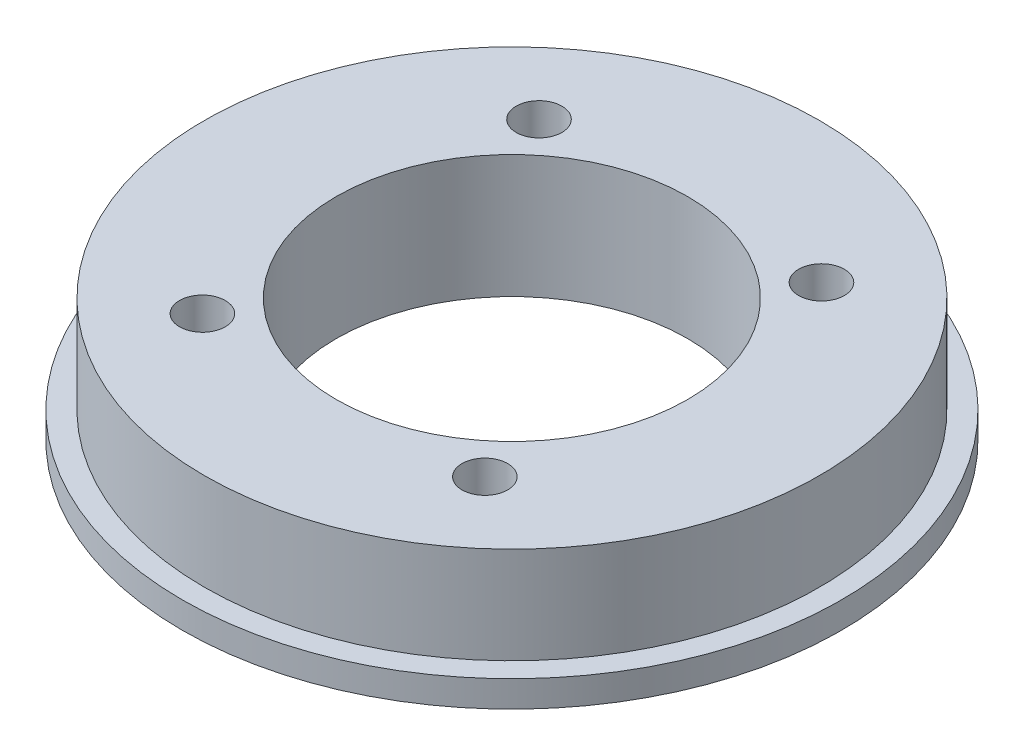
ISO-10303-21;
HEADER;
FILE_DESCRIPTION(('STEP AP214'),'2;1');
FILE_NAME('part.step','',(''),(''),'','','');
FILE_SCHEMA(('AUTOMOTIVE_DESIGN { 1 0 10303 214 1 1 1 1 }'));
ENDSEC;
DATA;
#1=APPLICATION_CONTEXT('core data for automotive mechanical design processes');
#2=APPLICATION_PROTOCOL_DEFINITION('international standard','automotive_design',2000,#1);
#3=PRODUCT_CONTEXT('',#1,'mechanical');
#4=PRODUCT('Part','Part','',(#3));
#5=PRODUCT_RELATED_PRODUCT_CATEGORY('part','',(#4));
#6=PRODUCT_DEFINITION_FORMATION('','',#4);
#7=PRODUCT_DEFINITION_CONTEXT('part definition',#1,'design');
#8=PRODUCT_DEFINITION('design','',#6,#7);
#9=PRODUCT_DEFINITION_SHAPE('','',#8);
#10=(LENGTH_UNIT() NAMED_UNIT(*) SI_UNIT(.MILLI.,.METRE.));
#11=(NAMED_UNIT(*) PLANE_ANGLE_UNIT() SI_UNIT($,.RADIAN.));
#12=(NAMED_UNIT(*) SI_UNIT($,.STERADIAN.) SOLID_ANGLE_UNIT());
#13=UNCERTAINTY_MEASURE_WITH_UNIT(LENGTH_MEASURE(1.E-05),#10,'distance_accuracy_value','');
#14=(GEOMETRIC_REPRESENTATION_CONTEXT(3) GLOBAL_UNCERTAINTY_ASSIGNED_CONTEXT((#13)) GLOBAL_UNIT_ASSIGNED_CONTEXT((#10,
#11,#12)) REPRESENTATION_CONTEXT('',''));
#15=CARTESIAN_POINT('',(0.,0.,0.));
#16=DIRECTION('',(0.,0.,1.));
#17=DIRECTION('',(1.,0.,0.));
#18=AXIS2_PLACEMENT_3D('',#15,#16,#17);
#19=CARTESIAN_POINT('',(-16.0696902421634,0.,19.1511110779745));
#20=DIRECTION('',(0.,1.,0.));
#21=DIRECTION('',(0.,0.,1.));
#22=AXIS2_PLACEMENT_3D('',#19,#20,#21);
#23=CYLINDRICAL_SURFACE('',#22,2.6);
#24=CARTESIAN_POINT('',(-16.0696902421634,14.,19.1511110779745));
#25=DIRECTION('',(0.,1.,0.));
#26=DIRECTION('',(0.,0.,1.));
#27=AXIS2_PLACEMENT_3D('',#24,#25,#26);
#28=CIRCLE('',#27,2.6);
#29=CARTESIAN_POINT('',(-16.0696902421634,14.,21.7511110779745));
#30=VERTEX_POINT('',#29);
#31=EDGE_CURVE('E89',#30,#30,#28,.T.);
#32=CARTESIAN_POINT('',(-16.0696902421634,3.,19.1511110779745));
#33=DIRECTION('',(0.,-1.,0.));
#34=DIRECTION('',(0.,0.,-1.));
#35=AXIS2_PLACEMENT_3D('',#32,#33,#34);
#36=CIRCLE('',#35,2.6);
#37=CARTESIAN_POINT('',(-16.0696902421634,3.,21.7511110779745));
#38=VERTEX_POINT('',#37);
#39=EDGE_CURVE('E37',#38,#38,#36,.F.);
#40=CARTESIAN_POINT('',(-16.0696902421634,14.,21.7511110779745));
#41=CARTESIAN_POINT('',(-16.0696902421634,13.8854166666667,21.7511110779745));
#42=CARTESIAN_POINT('',(-16.0696902421634,13.7708333333333,21.7511110779745));
#43=CARTESIAN_POINT('',(-16.0696902421634,13.5416666666667,21.7511110779745));
#44=CARTESIAN_POINT('',(-16.0696902421634,13.4270833333333,21.7511110779745));
#45=CARTESIAN_POINT('',(-16.0696902421634,13.1979166666667,21.7511110779745));
#46=CARTESIAN_POINT('',(-16.0696902421634,13.0833333333333,21.7511110779745));
#47=CARTESIAN_POINT('',(-16.0696902421634,12.8541666666667,21.7511110779745));
#48=CARTESIAN_POINT('',(-16.0696902421634,12.7395833333333,21.7511110779745));
#49=CARTESIAN_POINT('',(-16.0696902421634,12.5104166666667,21.7511110779745));
#50=CARTESIAN_POINT('',(-16.0696902421634,12.3958333333333,21.7511110779745));
#51=CARTESIAN_POINT('',(-16.0696902421634,12.1666666666667,21.7511110779745));
#52=CARTESIAN_POINT('',(-16.0696902421634,12.0520833333333,21.7511110779745));
#53=CARTESIAN_POINT('',(-16.0696902421634,11.8229166666667,21.7511110779745));
#54=CARTESIAN_POINT('',(-16.0696902421634,11.7083333333333,21.7511110779745));
#55=CARTESIAN_POINT('',(-16.0696902421634,11.4791666666667,21.7511110779745));
#56=CARTESIAN_POINT('',(-16.0696902421634,11.3645833333333,21.7511110779745));
#57=CARTESIAN_POINT('',(-16.0696902421634,11.1354166666667,21.7511110779745));
#58=CARTESIAN_POINT('',(-16.0696902421634,11.0208333333333,21.7511110779745));
#59=CARTESIAN_POINT('',(-16.0696902421634,10.7916666666667,21.7511110779745));
#60=CARTESIAN_POINT('',(-16.0696902421634,10.6770833333333,21.7511110779745));
#61=CARTESIAN_POINT('',(-16.0696902421634,10.4479166666667,21.7511110779745));
#62=CARTESIAN_POINT('',(-16.0696902421634,10.3333333333333,21.7511110779745));
#63=CARTESIAN_POINT('',(-16.0696902421634,10.1041666666667,21.7511110779745));
#64=CARTESIAN_POINT('',(-16.0696902421634,9.98958333333333,21.7511110779745));
#65=CARTESIAN_POINT('',(-16.0696902421634,9.76041666666666,21.7511110779745));
#66=CARTESIAN_POINT('',(-16.0696902421634,9.64583333333333,21.7511110779745));
#67=CARTESIAN_POINT('',(-16.0696902421634,9.41666666666667,21.7511110779745));
#68=CARTESIAN_POINT('',(-16.0696902421634,9.30208333333333,21.7511110779745));
#69=CARTESIAN_POINT('',(-16.0696902421634,9.07291666666666,21.7511110779745));
#70=CARTESIAN_POINT('',(-16.0696902421634,8.95833333333333,21.7511110779745));
#71=CARTESIAN_POINT('',(-16.0696902421634,8.72916666666667,21.7511110779745));
#72=CARTESIAN_POINT('',(-16.0696902421634,8.61458333333333,21.7511110779745));
#73=CARTESIAN_POINT('',(-16.0696902421634,8.38541666666667,21.7511110779745));
#74=CARTESIAN_POINT('',(-16.0696902421634,8.27083333333333,21.7511110779745));
#75=CARTESIAN_POINT('',(-16.0696902421634,8.04166666666667,21.7511110779745));
#76=CARTESIAN_POINT('',(-16.0696902421634,7.92708333333333,21.7511110779745));
#77=CARTESIAN_POINT('',(-16.0696902421634,7.69791666666667,21.7511110779745));
#78=CARTESIAN_POINT('',(-16.0696902421634,7.58333333333333,21.7511110779745));
#79=CARTESIAN_POINT('',(-16.0696902421634,7.35416666666667,21.7511110779745));
#80=CARTESIAN_POINT('',(-16.0696902421634,7.23958333333333,21.7511110779745));
#81=CARTESIAN_POINT('',(-16.0696902421634,7.01041666666667,21.7511110779745));
#82=CARTESIAN_POINT('',(-16.0696902421634,6.89583333333333,21.7511110779745));
#83=CARTESIAN_POINT('',(-16.0696902421634,6.66666666666667,21.7511110779745));
#84=CARTESIAN_POINT('',(-16.0696902421634,6.55208333333333,21.7511110779745));
#85=CARTESIAN_POINT('',(-16.0696902421634,6.32291666666667,21.7511110779745));
#86=CARTESIAN_POINT('',(-16.0696902421634,6.20833333333333,21.7511110779745));
#87=CARTESIAN_POINT('',(-16.0696902421634,5.97916666666667,21.7511110779745));
#88=CARTESIAN_POINT('',(-16.0696902421634,5.86458333333333,21.7511110779745));
#89=CARTESIAN_POINT('',(-16.0696902421634,5.63541666666667,21.7511110779745));
#90=CARTESIAN_POINT('',(-16.0696902421634,5.52083333333333,21.7511110779745));
#91=CARTESIAN_POINT('',(-16.0696902421634,5.29166666666667,21.7511110779745));
#92=CARTESIAN_POINT('',(-16.0696902421634,5.17708333333333,21.7511110779745));
#93=CARTESIAN_POINT('',(-16.0696902421634,4.94791666666667,21.7511110779745));
#94=CARTESIAN_POINT('',(-16.0696902421634,4.83333333333333,21.7511110779745));
#95=CARTESIAN_POINT('',(-16.0696902421634,4.60416666666667,21.7511110779745));
#96=CARTESIAN_POINT('',(-16.0696902421634,4.48958333333333,21.7511110779745));
#97=CARTESIAN_POINT('',(-16.0696902421634,4.26041666666667,21.7511110779745));
#98=CARTESIAN_POINT('',(-16.0696902421634,4.14583333333333,21.7511110779745));
#99=CARTESIAN_POINT('',(-16.0696902421634,3.91666666666667,21.7511110779745));
#100=CARTESIAN_POINT('',(-16.0696902421634,3.80208333333333,21.7511110779745));
#101=CARTESIAN_POINT('',(-16.0696902421634,3.57291666666667,21.7511110779745));
#102=CARTESIAN_POINT('',(-16.0696902421634,3.45833333333333,21.7511110779745));
#103=CARTESIAN_POINT('',(-16.0696902421634,3.22916666666667,21.7511110779745));
#104=CARTESIAN_POINT('',(-16.0696902421634,3.11458333333333,21.7511110779745));
#105=CARTESIAN_POINT('',(-16.0696902421634,3.,21.7511110779745));
#106=B_SPLINE_CURVE_WITH_KNOTS('',3,(#40,#41,#42,#43,#44,#45,#46,#47,#48,#49,#50,#51,#52,#53,
#54,#55,#56,#57,#58,#59,#60,#61,#62,#63,#64,#65,#66,#67,#68,#69,#70,#71,#72,#73,#74,#75,#76,#77,
#78,#79,#80,#81,#82,#83,#84,#85,#86,#87,#88,#89,#90,#91,#92,#93,#94,#95,#96,#97,#98,#99,#100,
#101,#102,#103,#104,#105),.UNSPECIFIED.,.F.,.F.,(4,2,2,2,2,2,2,2,2,2,2,2,2,2,2,2,2,2,2,2,2,2,2,
2,2,2,2,2,2,2,2,2,4),(0.,0.34375,0.687500000000001,1.03125,1.375,1.71875,2.0625,2.40625,2.75,
3.09375,3.4375,3.78125,4.125,4.46875,4.8125,5.15625,5.5,5.84375,6.1875,6.53125,6.875,7.21875,
7.5625,7.90625,8.25,8.59375,8.9375,9.28125,9.625,9.96875,10.3125,10.65625,11.),.UNSPECIFIED.);
#107=EDGE_CURVE('BSEAM33',#30,#38,#106,.T.);
#108=ORIENTED_EDGE('',*,*,#31,.T.);
#109=ORIENTED_EDGE('',*,*,#39,.F.);
#110=ORIENTED_EDGE('',*,*,#107,.T.);
#111=ORIENTED_EDGE('',*,*,#107,.F.);
#112=EDGE_LOOP('',(#108,#110,#109,#111));
#113=FACE_BOUND('',#112,.T.);
#114=ADVANCED_FACE('F33',(#113),#23,.F.);
#115=CARTESIAN_POINT('',(16.0696902421634,0.,19.1511110779745));
#116=DIRECTION('',(0.,1.,0.));
#117=DIRECTION('',(0.,0.,1.));
#118=AXIS2_PLACEMENT_3D('',#115,#116,#117);
#119=CYLINDRICAL_SURFACE('',#118,2.6);
#120=CARTESIAN_POINT('',(16.0696902421634,14.,19.1511110779745));
#121=DIRECTION('',(0.,1.,0.));
#122=DIRECTION('',(0.,0.,1.));
#123=AXIS2_PLACEMENT_3D('',#120,#121,#122);
#124=CIRCLE('',#123,2.6);
#125=CARTESIAN_POINT('',(16.0696902421634,14.,21.7511110779745));
#126=VERTEX_POINT('',#125);
#127=EDGE_CURVE('E94',#126,#126,#124,.T.);
#128=CARTESIAN_POINT('',(16.0696902421634,3.,19.1511110779745));
#129=DIRECTION('',(0.,-1.,0.));
#130=DIRECTION('',(0.,0.,-1.));
#131=AXIS2_PLACEMENT_3D('',#128,#129,#130);
#132=CIRCLE('',#131,2.6);
#133=CARTESIAN_POINT('',(16.0696902421634,3.,21.7511110779745));
#134=VERTEX_POINT('',#133);
#135=EDGE_CURVE('E61',#134,#134,#132,.F.);
#136=CARTESIAN_POINT('',(16.0696902421634,14.,21.7511110779745));
#137=CARTESIAN_POINT('',(16.0696902421634,13.8854166666667,21.7511110779745));
#138=CARTESIAN_POINT('',(16.0696902421634,13.7708333333333,21.7511110779745));
#139=CARTESIAN_POINT('',(16.0696902421634,13.5416666666667,21.7511110779745));
#140=CARTESIAN_POINT('',(16.0696902421634,13.4270833333333,21.7511110779745));
#141=CARTESIAN_POINT('',(16.0696902421634,13.1979166666667,21.7511110779745));
#142=CARTESIAN_POINT('',(16.0696902421634,13.0833333333333,21.7511110779745));
#143=CARTESIAN_POINT('',(16.0696902421634,12.8541666666667,21.7511110779745));
#144=CARTESIAN_POINT('',(16.0696902421634,12.7395833333333,21.7511110779745));
#145=CARTESIAN_POINT('',(16.0696902421634,12.5104166666667,21.7511110779745));
#146=CARTESIAN_POINT('',(16.0696902421634,12.3958333333333,21.7511110779745));
#147=CARTESIAN_POINT('',(16.0696902421634,12.1666666666667,21.7511110779745));
#148=CARTESIAN_POINT('',(16.0696902421634,12.0520833333333,21.7511110779745));
#149=CARTESIAN_POINT('',(16.0696902421634,11.8229166666667,21.7511110779745));
#150=CARTESIAN_POINT('',(16.0696902421634,11.7083333333333,21.7511110779745));
#151=CARTESIAN_POINT('',(16.0696902421634,11.4791666666667,21.7511110779745));
#152=CARTESIAN_POINT('',(16.0696902421634,11.3645833333333,21.7511110779745));
#153=CARTESIAN_POINT('',(16.0696902421634,11.1354166666667,21.7511110779745));
#154=CARTESIAN_POINT('',(16.0696902421634,11.0208333333333,21.7511110779745));
#155=CARTESIAN_POINT('',(16.0696902421634,10.7916666666667,21.7511110779745));
#156=CARTESIAN_POINT('',(16.0696902421634,10.6770833333333,21.7511110779745));
#157=CARTESIAN_POINT('',(16.0696902421634,10.4479166666667,21.7511110779745));
#158=CARTESIAN_POINT('',(16.0696902421634,10.3333333333333,21.7511110779745));
#159=CARTESIAN_POINT('',(16.0696902421634,10.1041666666667,21.7511110779745));
#160=CARTESIAN_POINT('',(16.0696902421634,9.98958333333333,21.7511110779745));
#161=CARTESIAN_POINT('',(16.0696902421634,9.76041666666666,21.7511110779745));
#162=CARTESIAN_POINT('',(16.0696902421634,9.64583333333333,21.7511110779745));
#163=CARTESIAN_POINT('',(16.0696902421634,9.41666666666667,21.7511110779745));
#164=CARTESIAN_POINT('',(16.0696902421634,9.30208333333333,21.7511110779745));
#165=CARTESIAN_POINT('',(16.0696902421634,9.07291666666666,21.7511110779745));
#166=CARTESIAN_POINT('',(16.0696902421634,8.95833333333333,21.7511110779745));
#167=CARTESIAN_POINT('',(16.0696902421634,8.72916666666667,21.7511110779745));
#168=CARTESIAN_POINT('',(16.0696902421634,8.61458333333333,21.7511110779745));
#169=CARTESIAN_POINT('',(16.0696902421634,8.38541666666667,21.7511110779745));
#170=CARTESIAN_POINT('',(16.0696902421634,8.27083333333333,21.7511110779745));
#171=CARTESIAN_POINT('',(16.0696902421634,8.04166666666667,21.7511110779745));
#172=CARTESIAN_POINT('',(16.0696902421634,7.92708333333333,21.7511110779745));
#173=CARTESIAN_POINT('',(16.0696902421634,7.69791666666667,21.7511110779745));
#174=CARTESIAN_POINT('',(16.0696902421634,7.58333333333333,21.7511110779745));
#175=CARTESIAN_POINT('',(16.0696902421634,7.35416666666667,21.7511110779745));
#176=CARTESIAN_POINT('',(16.0696902421634,7.23958333333333,21.7511110779745));
#177=CARTESIAN_POINT('',(16.0696902421634,7.01041666666667,21.7511110779745));
#178=CARTESIAN_POINT('',(16.0696902421634,6.89583333333333,21.7511110779745));
#179=CARTESIAN_POINT('',(16.0696902421634,6.66666666666667,21.7511110779745));
#180=CARTESIAN_POINT('',(16.0696902421634,6.55208333333333,21.7511110779745));
#181=CARTESIAN_POINT('',(16.0696902421634,6.32291666666667,21.7511110779745));
#182=CARTESIAN_POINT('',(16.0696902421634,6.20833333333333,21.7511110779745));
#183=CARTESIAN_POINT('',(16.0696902421634,5.97916666666667,21.7511110779745));
#184=CARTESIAN_POINT('',(16.0696902421634,5.86458333333333,21.7511110779745));
#185=CARTESIAN_POINT('',(16.0696902421634,5.63541666666667,21.7511110779745));
#186=CARTESIAN_POINT('',(16.0696902421634,5.52083333333333,21.7511110779745));
#187=CARTESIAN_POINT('',(16.0696902421634,5.29166666666667,21.7511110779745));
#188=CARTESIAN_POINT('',(16.0696902421634,5.17708333333333,21.7511110779745));
#189=CARTESIAN_POINT('',(16.0696902421634,4.94791666666667,21.7511110779745));
#190=CARTESIAN_POINT('',(16.0696902421634,4.83333333333333,21.7511110779745));
#191=CARTESIAN_POINT('',(16.0696902421634,4.60416666666667,21.7511110779745));
#192=CARTESIAN_POINT('',(16.0696902421634,4.48958333333333,21.7511110779745));
#193=CARTESIAN_POINT('',(16.0696902421634,4.26041666666667,21.7511110779745));
#194=CARTESIAN_POINT('',(16.0696902421634,4.14583333333333,21.7511110779745));
#195=CARTESIAN_POINT('',(16.0696902421634,3.91666666666667,21.7511110779745));
#196=CARTESIAN_POINT('',(16.0696902421634,3.80208333333333,21.7511110779745));
#197=CARTESIAN_POINT('',(16.0696902421634,3.57291666666667,21.7511110779745));
#198=CARTESIAN_POINT('',(16.0696902421634,3.45833333333333,21.7511110779745));
#199=CARTESIAN_POINT('',(16.0696902421634,3.22916666666667,21.7511110779745));
#200=CARTESIAN_POINT('',(16.0696902421634,3.11458333333333,21.7511110779745));
#201=CARTESIAN_POINT('',(16.0696902421634,3.,21.7511110779745));
#202=B_SPLINE_CURVE_WITH_KNOTS('',3,(#136,#137,#138,#139,#140,#141,#142,#143,#144,#145,#146,
#147,#148,#149,#150,#151,#152,#153,#154,#155,#156,#157,#158,#159,#160,#161,#162,#163,#164,#165,
#166,#167,#168,#169,#170,#171,#172,#173,#174,#175,#176,#177,#178,#179,#180,#181,#182,#183,#184,
#185,#186,#187,#188,#189,#190,#191,#192,#193,#194,#195,#196,#197,#198,#199,#200,#201),
.UNSPECIFIED.,.F.,.F.,(4,2,2,2,2,2,2,2,2,2,2,2,2,2,2,2,2,2,2,2,2,2,2,2,2,2,2,2,2,2,2,2,4),(0.,
0.34375,0.687500000000001,1.03125,1.375,1.71875,2.0625,2.40625,2.75,3.09375,3.4375,3.78125,
4.125,4.46875,4.8125,5.15625,5.5,5.84375,6.1875,6.53125,6.875,7.21875,7.5625,7.90625,8.25,
8.59375,8.9375,9.28125,9.625,9.96875,10.3125,10.65625,11.),.UNSPECIFIED.);
#203=EDGE_CURVE('BSEAM125',#126,#134,#202,.T.);
#204=ORIENTED_EDGE('',*,*,#127,.T.);
#205=ORIENTED_EDGE('',*,*,#135,.F.);
#206=ORIENTED_EDGE('',*,*,#203,.T.);
#207=ORIENTED_EDGE('',*,*,#203,.F.);
#208=EDGE_LOOP('',(#204,#206,#205,#207));
#209=FACE_BOUND('',#208,.T.);
#210=ADVANCED_FACE('F125',(#209),#119,.F.);
#211=CARTESIAN_POINT('',(-16.0696902421634,0.,-19.1511110779745));
#212=DIRECTION('',(0.,1.,0.));
#213=DIRECTION('',(0.,0.,1.));
#214=AXIS2_PLACEMENT_3D('',#211,#212,#213);
#215=CYLINDRICAL_SURFACE('',#214,2.6);
#216=CARTESIAN_POINT('',(-16.0696902421634,14.,-19.1511110779745));
#217=DIRECTION('',(0.,1.,0.));
#218=DIRECTION('',(0.,0.,1.));
#219=AXIS2_PLACEMENT_3D('',#216,#217,#218);
#220=CIRCLE('',#219,2.6);
#221=CARTESIAN_POINT('',(-16.0696902421634,14.,-16.5511110779745));
#222=VERTEX_POINT('',#221);
#223=EDGE_CURVE('E100',#222,#222,#220,.T.);
#224=CARTESIAN_POINT('',(-16.0696902421634,3.,-19.1511110779745));
#225=DIRECTION('',(0.,-1.,0.));
#226=DIRECTION('',(0.,0.,-1.));
#227=AXIS2_PLACEMENT_3D('',#224,#225,#226);
#228=CIRCLE('',#227,2.6);
#229=CARTESIAN_POINT('',(-16.0696902421634,3.,-16.5511110779745));
#230=VERTEX_POINT('',#229);
#231=EDGE_CURVE('E57',#230,#230,#228,.F.);
#232=CARTESIAN_POINT('',(-16.0696902421634,14.,-16.5511110779745));
#233=CARTESIAN_POINT('',(-16.0696902421634,13.8854166666667,-16.5511110779745));
#234=CARTESIAN_POINT('',(-16.0696902421634,13.7708333333333,-16.5511110779745));
#235=CARTESIAN_POINT('',(-16.0696902421634,13.5416666666667,-16.5511110779745));
#236=CARTESIAN_POINT('',(-16.0696902421634,13.4270833333333,-16.5511110779745));
#237=CARTESIAN_POINT('',(-16.0696902421634,13.1979166666667,-16.5511110779745));
#238=CARTESIAN_POINT('',(-16.0696902421634,13.0833333333333,-16.5511110779745));
#239=CARTESIAN_POINT('',(-16.0696902421634,12.8541666666667,-16.5511110779745));
#240=CARTESIAN_POINT('',(-16.0696902421634,12.7395833333333,-16.5511110779745));
#241=CARTESIAN_POINT('',(-16.0696902421634,12.5104166666667,-16.5511110779745));
#242=CARTESIAN_POINT('',(-16.0696902421634,12.3958333333333,-16.5511110779745));
#243=CARTESIAN_POINT('',(-16.0696902421634,12.1666666666667,-16.5511110779745));
#244=CARTESIAN_POINT('',(-16.0696902421634,12.0520833333333,-16.5511110779745));
#245=CARTESIAN_POINT('',(-16.0696902421634,11.8229166666667,-16.5511110779745));
#246=CARTESIAN_POINT('',(-16.0696902421634,11.7083333333333,-16.5511110779745));
#247=CARTESIAN_POINT('',(-16.0696902421634,11.4791666666667,-16.5511110779745));
#248=CARTESIAN_POINT('',(-16.0696902421634,11.3645833333333,-16.5511110779745));
#249=CARTESIAN_POINT('',(-16.0696902421634,11.1354166666667,-16.5511110779745));
#250=CARTESIAN_POINT('',(-16.0696902421634,11.0208333333333,-16.5511110779745));
#251=CARTESIAN_POINT('',(-16.0696902421634,10.7916666666667,-16.5511110779745));
#252=CARTESIAN_POINT('',(-16.0696902421634,10.6770833333333,-16.5511110779745));
#253=CARTESIAN_POINT('',(-16.0696902421634,10.4479166666667,-16.5511110779745));
#254=CARTESIAN_POINT('',(-16.0696902421634,10.3333333333333,-16.5511110779745));
#255=CARTESIAN_POINT('',(-16.0696902421634,10.1041666666667,-16.5511110779745));
#256=CARTESIAN_POINT('',(-16.0696902421634,9.98958333333333,-16.5511110779745));
#257=CARTESIAN_POINT('',(-16.0696902421634,9.76041666666666,-16.5511110779745));
#258=CARTESIAN_POINT('',(-16.0696902421634,9.64583333333333,-16.5511110779745));
#259=CARTESIAN_POINT('',(-16.0696902421634,9.41666666666667,-16.5511110779745));
#260=CARTESIAN_POINT('',(-16.0696902421634,9.30208333333333,-16.5511110779745));
#261=CARTESIAN_POINT('',(-16.0696902421634,9.07291666666666,-16.5511110779745));
#262=CARTESIAN_POINT('',(-16.0696902421634,8.95833333333333,-16.5511110779745));
#263=CARTESIAN_POINT('',(-16.0696902421634,8.72916666666667,-16.5511110779745));
#264=CARTESIAN_POINT('',(-16.0696902421634,8.61458333333333,-16.5511110779745));
#265=CARTESIAN_POINT('',(-16.0696902421634,8.38541666666667,-16.5511110779745));
#266=CARTESIAN_POINT('',(-16.0696902421634,8.27083333333333,-16.5511110779745));
#267=CARTESIAN_POINT('',(-16.0696902421634,8.04166666666667,-16.5511110779745));
#268=CARTESIAN_POINT('',(-16.0696902421634,7.92708333333333,-16.5511110779745));
#269=CARTESIAN_POINT('',(-16.0696902421634,7.69791666666667,-16.5511110779745));
#270=CARTESIAN_POINT('',(-16.0696902421634,7.58333333333333,-16.5511110779745));
#271=CARTESIAN_POINT('',(-16.0696902421634,7.35416666666667,-16.5511110779745));
#272=CARTESIAN_POINT('',(-16.0696902421634,7.23958333333333,-16.5511110779745));
#273=CARTESIAN_POINT('',(-16.0696902421634,7.01041666666667,-16.5511110779745));
#274=CARTESIAN_POINT('',(-16.0696902421634,6.89583333333333,-16.5511110779745));
#275=CARTESIAN_POINT('',(-16.0696902421634,6.66666666666667,-16.5511110779745));
#276=CARTESIAN_POINT('',(-16.0696902421634,6.55208333333333,-16.5511110779745));
#277=CARTESIAN_POINT('',(-16.0696902421634,6.32291666666667,-16.5511110779745));
#278=CARTESIAN_POINT('',(-16.0696902421634,6.20833333333333,-16.5511110779745));
#279=CARTESIAN_POINT('',(-16.0696902421634,5.97916666666667,-16.5511110779745));
#280=CARTESIAN_POINT('',(-16.0696902421634,5.86458333333333,-16.5511110779745));
#281=CARTESIAN_POINT('',(-16.0696902421634,5.63541666666667,-16.5511110779745));
#282=CARTESIAN_POINT('',(-16.0696902421634,5.52083333333333,-16.5511110779745));
#283=CARTESIAN_POINT('',(-16.0696902421634,5.29166666666667,-16.5511110779745));
#284=CARTESIAN_POINT('',(-16.0696902421634,5.17708333333333,-16.5511110779745));
#285=CARTESIAN_POINT('',(-16.0696902421634,4.94791666666667,-16.5511110779745));
#286=CARTESIAN_POINT('',(-16.0696902421634,4.83333333333333,-16.5511110779745));
#287=CARTESIAN_POINT('',(-16.0696902421634,4.60416666666667,-16.5511110779745));
#288=CARTESIAN_POINT('',(-16.0696902421634,4.48958333333333,-16.5511110779745));
#289=CARTESIAN_POINT('',(-16.0696902421634,4.26041666666667,-16.5511110779745));
#290=CARTESIAN_POINT('',(-16.0696902421634,4.14583333333333,-16.5511110779745));
#291=CARTESIAN_POINT('',(-16.0696902421634,3.91666666666667,-16.5511110779745));
#292=CARTESIAN_POINT('',(-16.0696902421634,3.80208333333333,-16.5511110779745));
#293=CARTESIAN_POINT('',(-16.0696902421634,3.57291666666667,-16.5511110779745));
#294=CARTESIAN_POINT('',(-16.0696902421634,3.45833333333333,-16.5511110779745));
#295=CARTESIAN_POINT('',(-16.0696902421634,3.22916666666667,-16.5511110779745));
#296=CARTESIAN_POINT('',(-16.0696902421634,3.11458333333333,-16.5511110779745));
#297=CARTESIAN_POINT('',(-16.0696902421634,3.,-16.5511110779745));
#298=B_SPLINE_CURVE_WITH_KNOTS('',3,(#232,#233,#234,#235,#236,#237,#238,#239,#240,#241,#242,
#243,#244,#245,#246,#247,#248,#249,#250,#251,#252,#253,#254,#255,#256,#257,#258,#259,#260,#261,
#262,#263,#264,#265,#266,#267,#268,#269,#270,#271,#272,#273,#274,#275,#276,#277,#278,#279,#280,
#281,#282,#283,#284,#285,#286,#287,#288,#289,#290,#291,#292,#293,#294,#295,#296,#297),
.UNSPECIFIED.,.F.,.F.,(4,2,2,2,2,2,2,2,2,2,2,2,2,2,2,2,2,2,2,2,2,2,2,2,2,2,2,2,2,2,2,2,4),(0.,
0.34375,0.687500000000001,1.03125,1.375,1.71875,2.0625,2.40625,2.75,3.09375,3.4375,3.78125,
4.125,4.46875,4.8125,5.15625,5.5,5.84375,6.1875,6.53125,6.875,7.21875,7.5625,7.90625,8.25,
8.59375,8.9375,9.28125,9.625,9.96875,10.3125,10.65625,11.),.UNSPECIFIED.);
#299=EDGE_CURVE('BSEAM120',#222,#230,#298,.T.);
#300=ORIENTED_EDGE('',*,*,#223,.T.);
#301=ORIENTED_EDGE('',*,*,#231,.F.);
#302=ORIENTED_EDGE('',*,*,#299,.T.);
#303=ORIENTED_EDGE('',*,*,#299,.F.);
#304=EDGE_LOOP('',(#300,#302,#301,#303));
#305=FACE_BOUND('',#304,.T.);
#306=ADVANCED_FACE('F120',(#305),#215,.F.);
#307=CARTESIAN_POINT('',(16.0696902421634,0.,-19.1511110779745));
#308=DIRECTION('',(0.,1.,0.));
#309=DIRECTION('',(0.,0.,1.));
#310=AXIS2_PLACEMENT_3D('',#307,#308,#309);
#311=CYLINDRICAL_SURFACE('',#310,2.6);
#312=CARTESIAN_POINT('',(16.0696902421634,14.,-19.1511110779745));
#313=DIRECTION('',(0.,1.,0.));
#314=DIRECTION('',(0.,0.,1.));
#315=AXIS2_PLACEMENT_3D('',#312,#313,#314);
#316=CIRCLE('',#315,2.6);
#317=CARTESIAN_POINT('',(16.0696902421634,14.,-16.5511110779745));
#318=VERTEX_POINT('',#317);
#319=EDGE_CURVE('E97',#318,#318,#316,.T.);
#320=CARTESIAN_POINT('',(16.0696902421634,3.,-19.1511110779745));
#321=DIRECTION('',(0.,-1.,0.));
#322=DIRECTION('',(0.,0.,-1.));
#323=AXIS2_PLACEMENT_3D('',#320,#321,#322);
#324=CIRCLE('',#323,2.6);
#325=CARTESIAN_POINT('',(16.0696902421634,3.,-16.5511110779745));
#326=VERTEX_POINT('',#325);
#327=EDGE_CURVE('E52',#326,#326,#324,.F.);
#328=CARTESIAN_POINT('',(16.0696902421634,14.,-16.5511110779745));
#329=CARTESIAN_POINT('',(16.0696902421634,13.8854166666667,-16.5511110779745));
#330=CARTESIAN_POINT('',(16.0696902421634,13.7708333333333,-16.5511110779745));
#331=CARTESIAN_POINT('',(16.0696902421634,13.5416666666667,-16.5511110779745));
#332=CARTESIAN_POINT('',(16.0696902421634,13.4270833333333,-16.5511110779745));
#333=CARTESIAN_POINT('',(16.0696902421634,13.1979166666667,-16.5511110779745));
#334=CARTESIAN_POINT('',(16.0696902421634,13.0833333333333,-16.5511110779745));
#335=CARTESIAN_POINT('',(16.0696902421634,12.8541666666667,-16.5511110779745));
#336=CARTESIAN_POINT('',(16.0696902421634,12.7395833333333,-16.5511110779745));
#337=CARTESIAN_POINT('',(16.0696902421634,12.5104166666667,-16.5511110779745));
#338=CARTESIAN_POINT('',(16.0696902421634,12.3958333333333,-16.5511110779745));
#339=CARTESIAN_POINT('',(16.0696902421634,12.1666666666667,-16.5511110779745));
#340=CARTESIAN_POINT('',(16.0696902421634,12.0520833333333,-16.5511110779745));
#341=CARTESIAN_POINT('',(16.0696902421634,11.8229166666667,-16.5511110779745));
#342=CARTESIAN_POINT('',(16.0696902421634,11.7083333333333,-16.5511110779745));
#343=CARTESIAN_POINT('',(16.0696902421634,11.4791666666667,-16.5511110779745));
#344=CARTESIAN_POINT('',(16.0696902421634,11.3645833333333,-16.5511110779745));
#345=CARTESIAN_POINT('',(16.0696902421634,11.1354166666667,-16.5511110779745));
#346=CARTESIAN_POINT('',(16.0696902421634,11.0208333333333,-16.5511110779745));
#347=CARTESIAN_POINT('',(16.0696902421634,10.7916666666667,-16.5511110779745));
#348=CARTESIAN_POINT('',(16.0696902421634,10.6770833333333,-16.5511110779745));
#349=CARTESIAN_POINT('',(16.0696902421634,10.4479166666667,-16.5511110779745));
#350=CARTESIAN_POINT('',(16.0696902421634,10.3333333333333,-16.5511110779745));
#351=CARTESIAN_POINT('',(16.0696902421634,10.1041666666667,-16.5511110779745));
#352=CARTESIAN_POINT('',(16.0696902421634,9.98958333333333,-16.5511110779745));
#353=CARTESIAN_POINT('',(16.0696902421634,9.76041666666666,-16.5511110779745));
#354=CARTESIAN_POINT('',(16.0696902421634,9.64583333333333,-16.5511110779745));
#355=CARTESIAN_POINT('',(16.0696902421634,9.41666666666667,-16.5511110779745));
#356=CARTESIAN_POINT('',(16.0696902421634,9.30208333333333,-16.5511110779745));
#357=CARTESIAN_POINT('',(16.0696902421634,9.07291666666666,-16.5511110779745));
#358=CARTESIAN_POINT('',(16.0696902421634,8.95833333333333,-16.5511110779745));
#359=CARTESIAN_POINT('',(16.0696902421634,8.72916666666667,-16.5511110779745));
#360=CARTESIAN_POINT('',(16.0696902421634,8.61458333333333,-16.5511110779745));
#361=CARTESIAN_POINT('',(16.0696902421634,8.38541666666667,-16.5511110779745));
#362=CARTESIAN_POINT('',(16.0696902421634,8.27083333333333,-16.5511110779745));
#363=CARTESIAN_POINT('',(16.0696902421634,8.04166666666667,-16.5511110779745));
#364=CARTESIAN_POINT('',(16.0696902421634,7.92708333333333,-16.5511110779745));
#365=CARTESIAN_POINT('',(16.0696902421634,7.69791666666667,-16.5511110779745));
#366=CARTESIAN_POINT('',(16.0696902421634,7.58333333333333,-16.5511110779745));
#367=CARTESIAN_POINT('',(16.0696902421634,7.35416666666667,-16.5511110779745));
#368=CARTESIAN_POINT('',(16.0696902421634,7.23958333333333,-16.5511110779745));
#369=CARTESIAN_POINT('',(16.0696902421634,7.01041666666667,-16.5511110779745));
#370=CARTESIAN_POINT('',(16.0696902421634,6.89583333333333,-16.5511110779745));
#371=CARTESIAN_POINT('',(16.0696902421634,6.66666666666667,-16.5511110779745));
#372=CARTESIAN_POINT('',(16.0696902421634,6.55208333333333,-16.5511110779745));
#373=CARTESIAN_POINT('',(16.0696902421634,6.32291666666667,-16.5511110779745));
#374=CARTESIAN_POINT('',(16.0696902421634,6.20833333333333,-16.5511110779745));
#375=CARTESIAN_POINT('',(16.0696902421634,5.97916666666667,-16.5511110779745));
#376=CARTESIAN_POINT('',(16.0696902421634,5.86458333333333,-16.5511110779745));
#377=CARTESIAN_POINT('',(16.0696902421634,5.63541666666667,-16.5511110779745));
#378=CARTESIAN_POINT('',(16.0696902421634,5.52083333333333,-16.5511110779745));
#379=CARTESIAN_POINT('',(16.0696902421634,5.29166666666667,-16.5511110779745));
#380=CARTESIAN_POINT('',(16.0696902421634,5.17708333333333,-16.5511110779745));
#381=CARTESIAN_POINT('',(16.0696902421634,4.94791666666667,-16.5511110779745));
#382=CARTESIAN_POINT('',(16.0696902421634,4.83333333333333,-16.5511110779745));
#383=CARTESIAN_POINT('',(16.0696902421634,4.60416666666667,-16.5511110779745));
#384=CARTESIAN_POINT('',(16.0696902421634,4.48958333333333,-16.5511110779745));
#385=CARTESIAN_POINT('',(16.0696902421634,4.26041666666667,-16.5511110779745));
#386=CARTESIAN_POINT('',(16.0696902421634,4.14583333333333,-16.5511110779745));
#387=CARTESIAN_POINT('',(16.0696902421634,3.91666666666667,-16.5511110779745));
#388=CARTESIAN_POINT('',(16.0696902421634,3.80208333333333,-16.5511110779745));
#389=CARTESIAN_POINT('',(16.0696902421634,3.57291666666667,-16.5511110779745));
#390=CARTESIAN_POINT('',(16.0696902421634,3.45833333333333,-16.5511110779745));
#391=CARTESIAN_POINT('',(16.0696902421634,3.22916666666667,-16.5511110779745));
#392=CARTESIAN_POINT('',(16.0696902421634,3.11458333333333,-16.5511110779745));
#393=CARTESIAN_POINT('',(16.0696902421634,3.,-16.5511110779745));
#394=B_SPLINE_CURVE_WITH_KNOTS('',3,(#328,#329,#330,#331,#332,#333,#334,#335,#336,#337,#338,
#339,#340,#341,#342,#343,#344,#345,#346,#347,#348,#349,#350,#351,#352,#353,#354,#355,#356,#357,
#358,#359,#360,#361,#362,#363,#364,#365,#366,#367,#368,#369,#370,#371,#372,#373,#374,#375,#376,
#377,#378,#379,#380,#381,#382,#383,#384,#385,#386,#387,#388,#389,#390,#391,#392,#393),
.UNSPECIFIED.,.F.,.F.,(4,2,2,2,2,2,2,2,2,2,2,2,2,2,2,2,2,2,2,2,2,2,2,2,2,2,2,2,2,2,2,2,4),(0.,
0.34375,0.687500000000001,1.03125,1.375,1.71875,2.0625,2.40625,2.75,3.09375,3.4375,3.78125,
4.125,4.46875,4.8125,5.15625,5.5,5.84375,6.1875,6.53125,6.875,7.21875,7.5625,7.90625,8.25,
8.59375,8.9375,9.28125,9.625,9.96875,10.3125,10.65625,11.),.UNSPECIFIED.);
#395=EDGE_CURVE('BSEAM112',#318,#326,#394,.T.);
#396=ORIENTED_EDGE('',*,*,#319,.T.);
#397=ORIENTED_EDGE('',*,*,#327,.F.);
#398=ORIENTED_EDGE('',*,*,#395,.T.);
#399=ORIENTED_EDGE('',*,*,#395,.F.);
#400=EDGE_LOOP('',(#396,#398,#397,#399));
#401=FACE_BOUND('',#400,.T.);
#402=ADVANCED_FACE('F112',(#401),#311,.F.);
#403=CARTESIAN_POINT('',(0.,3.,0.));
#404=DIRECTION('',(0.,1.,0.));
#405=DIRECTION('',(0.,0.,1.));
#406=AXIS2_PLACEMENT_3D('',#403,#404,#405);
#407=PLANE('',#406);
#408=CARTESIAN_POINT('',(0.,3.,0.));
#409=DIRECTION('',(0.,1.,0.));
#410=DIRECTION('',(0.,0.,1.));
#411=AXIS2_PLACEMENT_3D('',#408,#409,#410);
#412=CIRCLE('',#411,37.5);
#413=CARTESIAN_POINT('',(0.,3.,37.5));
#414=VERTEX_POINT('',#413);
#415=EDGE_CURVE('E10',#414,#414,#412,.T.);
#416=ORIENTED_EDGE('',*,*,#415,.T.);
#417=EDGE_LOOP('',(#416));
#418=FACE_BOUND('',#417,.T.);
#419=CARTESIAN_POINT('',(0.,3.,0.));
#420=DIRECTION('',(0.,1.,0.));
#421=DIRECTION('',(0.,0.,1.));
#422=AXIS2_PLACEMENT_3D('',#419,#420,#421);
#423=CIRCLE('',#422,35.);
#424=CARTESIAN_POINT('',(0.,3.,35.));
#425=VERTEX_POINT('',#424);
#426=EDGE_CURVE('E49',#425,#425,#423,.T.);
#427=ORIENTED_EDGE('',*,*,#426,.F.);
#428=EDGE_LOOP('',(#427));
#429=FACE_BOUND('',#428,.T.);
#430=ADVANCED_FACE('F110',(#418,#429),#407,.T.);
#431=CARTESIAN_POINT('',(0.,3.,0.));
#432=DIRECTION('',(0.,-1.,0.));
#433=DIRECTION('',(0.,0.,-1.));
#434=AXIS2_PLACEMENT_3D('',#431,#432,#433);
#435=CYLINDRICAL_SURFACE('',#434,37.5);
#436=ORIENTED_EDGE('',*,*,#415,.F.);
#437=EDGE_LOOP('',(#436));
#438=FACE_BOUND('',#437,.T.);
#439=CARTESIAN_POINT('',(0.,0.,0.));
#440=DIRECTION('',(0.,1.,0.));
#441=DIRECTION('',(0.,0.,1.));
#442=AXIS2_PLACEMENT_3D('',#439,#440,#441);
#443=CIRCLE('',#442,37.5);
#444=CARTESIAN_POINT('',(0.,0.,37.5));
#445=VERTEX_POINT('',#444);
#446=EDGE_CURVE('E41',#445,#445,#443,.T.);
#447=ORIENTED_EDGE('',*,*,#446,.T.);
#448=EDGE_LOOP('',(#447));
#449=FACE_BOUND('',#448,.T.);
#450=ADVANCED_FACE('F35',(#438,#449),#435,.T.);
#451=CARTESIAN_POINT('',(0.,0.,0.));
#452=DIRECTION('',(0.,1.,0.));
#453=DIRECTION('',(0.,0.,1.));
#454=AXIS2_PLACEMENT_3D('',#451,#452,#453);
#455=PLANE('',#454);
#456=CARTESIAN_POINT('',(-16.0696902421634,0.,19.1511110779745));
#457=DIRECTION('',(0.,-1.,0.));
#458=DIRECTION('',(0.,0.,-1.));
#459=AXIS2_PLACEMENT_3D('',#456,#457,#458);
#460=CIRCLE('',#459,4.75);
#461=CARTESIAN_POINT('',(-16.0696902421634,0.,14.4011110779745));
#462=VERTEX_POINT('',#461);
#463=EDGE_CURVE('E77',#462,#462,#460,.T.);
#464=ORIENTED_EDGE('',*,*,#463,.F.);
#465=EDGE_LOOP('',(#464));
#466=FACE_BOUND('',#465,.T.);
#467=CARTESIAN_POINT('',(16.0696902421634,0.,19.1511110779745));
#468=DIRECTION('',(0.,-1.,0.));
#469=DIRECTION('',(0.,0.,-1.));
#470=AXIS2_PLACEMENT_3D('',#467,#468,#469);
#471=CIRCLE('',#470,4.75);
#472=CARTESIAN_POINT('',(16.0696902421634,0.,14.4011110779745));
#473=VERTEX_POINT('',#472);
#474=EDGE_CURVE('E70',#473,#473,#471,.T.);
#475=ORIENTED_EDGE('',*,*,#474,.F.);
#476=EDGE_LOOP('',(#475));
#477=FACE_BOUND('',#476,.T.);
#478=CARTESIAN_POINT('',(-16.0696902421634,0.,-19.1511110779745));
#479=DIRECTION('',(0.,-1.,0.));
#480=DIRECTION('',(0.,0.,-1.));
#481=AXIS2_PLACEMENT_3D('',#478,#479,#480);
#482=CIRCLE('',#481,4.75);
#483=CARTESIAN_POINT('',(-16.0696902421634,0.,-23.9011110779745));
#484=VERTEX_POINT('',#483);
#485=EDGE_CURVE('E63',#484,#484,#482,.T.);
#486=ORIENTED_EDGE('',*,*,#485,.F.);
#487=EDGE_LOOP('',(#486));
#488=FACE_BOUND('',#487,.T.);
#489=CARTESIAN_POINT('',(16.0696902421634,0.,-19.1511110779745));
#490=DIRECTION('',(0.,-1.,0.));
#491=DIRECTION('',(0.,0.,-1.));
#492=AXIS2_PLACEMENT_3D('',#489,#490,#491);
#493=CIRCLE('',#492,4.75);
#494=CARTESIAN_POINT('',(16.0696902421634,0.,-23.9011110779745));
#495=VERTEX_POINT('',#494);
#496=EDGE_CURVE('E59',#495,#495,#493,.T.);
#497=ORIENTED_EDGE('',*,*,#496,.F.);
#498=EDGE_LOOP('',(#497));
#499=FACE_BOUND('',#498,.T.);
#500=CARTESIAN_POINT('',(0.,0.,0.));
#501=DIRECTION('',(0.,1.,0.));
#502=DIRECTION('',(0.,0.,1.));
#503=AXIS2_PLACEMENT_3D('',#500,#501,#502);
#504=CIRCLE('',#503,20.);
#505=CARTESIAN_POINT('',(0.,0.,20.));
#506=VERTEX_POINT('',#505);
#507=EDGE_CURVE('E86',#506,#506,#504,.T.);
#508=ORIENTED_EDGE('',*,*,#507,.T.);
#509=EDGE_LOOP('',(#508));
#510=FACE_BOUND('',#509,.T.);
#511=ORIENTED_EDGE('',*,*,#446,.F.);
#512=EDGE_LOOP('',(#511));
#513=FACE_BOUND('',#512,.T.);
#514=ADVANCED_FACE('F118',(#466,#477,#488,#499,#510,#513),#455,.F.);
#515=CARTESIAN_POINT('',(0.,14.,0.));
#516=DIRECTION('',(0.,-1.,0.));
#517=DIRECTION('',(0.,0.,-1.));
#518=AXIS2_PLACEMENT_3D('',#515,#516,#517);
#519=CYLINDRICAL_SURFACE('',#518,35.);
#520=CARTESIAN_POINT('',(0.,14.,0.));
#521=DIRECTION('',(0.,1.,0.));
#522=DIRECTION('',(0.,0.,1.));
#523=AXIS2_PLACEMENT_3D('',#520,#521,#522);
#524=CIRCLE('',#523,35.);
#525=CARTESIAN_POINT('',(0.,14.,35.));
#526=VERTEX_POINT('',#525);
#527=EDGE_CURVE('E46',#526,#526,#524,.T.);
#528=ORIENTED_EDGE('',*,*,#527,.F.);
#529=EDGE_LOOP('',(#528));
#530=FACE_BOUND('',#529,.T.);
#531=ORIENTED_EDGE('',*,*,#426,.T.);
#532=EDGE_LOOP('',(#531));
#533=FACE_BOUND('',#532,.T.);
#534=ADVANCED_FACE('F108',(#530,#533),#519,.T.);
#535=CARTESIAN_POINT('',(0.,14.,0.));
#536=DIRECTION('',(0.,1.,0.));
#537=DIRECTION('',(0.,0.,1.));
#538=AXIS2_PLACEMENT_3D('',#535,#536,#537);
#539=PLANE('',#538);
#540=CARTESIAN_POINT('',(0.,14.,0.));
#541=DIRECTION('',(0.,1.,0.));
#542=DIRECTION('',(0.,0.,1.));
#543=AXIS2_PLACEMENT_3D('',#540,#541,#542);
#544=CIRCLE('',#543,20.);
#545=CARTESIAN_POINT('',(0.,14.,20.));
#546=VERTEX_POINT('',#545);
#547=EDGE_CURVE('E55',#546,#546,#544,.T.);
#548=ORIENTED_EDGE('',*,*,#547,.F.);
#549=EDGE_LOOP('',(#548));
#550=FACE_BOUND('',#549,.T.);
#551=ORIENTED_EDGE('',*,*,#31,.F.);
#552=EDGE_LOOP('',(#551));
#553=FACE_BOUND('',#552,.T.);
#554=ORIENTED_EDGE('',*,*,#127,.F.);
#555=EDGE_LOOP('',(#554));
#556=FACE_BOUND('',#555,.T.);
#557=ORIENTED_EDGE('',*,*,#319,.F.);
#558=EDGE_LOOP('',(#557));
#559=FACE_BOUND('',#558,.T.);
#560=ORIENTED_EDGE('',*,*,#223,.F.);
#561=EDGE_LOOP('',(#560));
#562=FACE_BOUND('',#561,.T.);
#563=ORIENTED_EDGE('',*,*,#527,.T.);
#564=EDGE_LOOP('',(#563));
#565=FACE_BOUND('',#564,.T.);
#566=ADVANCED_FACE('F141',(#550,#553,#556,#559,#562,#565),#539,.T.);
#567=CARTESIAN_POINT('',(0.,0.,0.));
#568=DIRECTION('',(0.,1.,0.));
#569=DIRECTION('',(0.,0.,1.));
#570=AXIS2_PLACEMENT_3D('',#567,#568,#569);
#571=CYLINDRICAL_SURFACE('',#570,20.);
#572=CARTESIAN_POINT('',(0.,0.,20.));
#573=CARTESIAN_POINT('',(0.,0.145833333333333,20.));
#574=CARTESIAN_POINT('',(0.,0.291666666666667,20.));
#575=CARTESIAN_POINT('',(0.,0.583333333333333,20.));
#576=CARTESIAN_POINT('',(0.,0.729166666666667,20.));
#577=CARTESIAN_POINT('',(0.,1.02083333333333,20.));
#578=CARTESIAN_POINT('',(0.,1.16666666666667,20.));
#579=CARTESIAN_POINT('',(0.,1.45833333333333,20.));
#580=CARTESIAN_POINT('',(0.,1.60416666666667,20.));
#581=CARTESIAN_POINT('',(0.,1.89583333333333,20.));
#582=CARTESIAN_POINT('',(0.,2.04166666666667,20.));
#583=CARTESIAN_POINT('',(0.,2.33333333333333,20.));
#584=CARTESIAN_POINT('',(0.,2.47916666666667,20.));
#585=CARTESIAN_POINT('',(0.,2.77083333333333,20.));
#586=CARTESIAN_POINT('',(0.,2.91666666666667,20.));
#587=CARTESIAN_POINT('',(0.,3.20833333333333,20.));
#588=CARTESIAN_POINT('',(0.,3.35416666666667,20.));
#589=CARTESIAN_POINT('',(0.,3.64583333333333,20.));
#590=CARTESIAN_POINT('',(0.,3.79166666666667,20.));
#591=CARTESIAN_POINT('',(0.,4.08333333333333,20.));
#592=CARTESIAN_POINT('',(0.,4.22916666666667,20.));
#593=CARTESIAN_POINT('',(0.,4.52083333333333,20.));
#594=CARTESIAN_POINT('',(0.,4.66666666666667,20.));
#595=CARTESIAN_POINT('',(0.,4.95833333333333,20.));
#596=CARTESIAN_POINT('',(0.,5.10416666666667,20.));
#597=CARTESIAN_POINT('',(0.,5.39583333333333,20.));
#598=CARTESIAN_POINT('',(0.,5.54166666666667,20.));
#599=CARTESIAN_POINT('',(0.,5.83333333333333,20.));
#600=CARTESIAN_POINT('',(0.,5.97916666666667,20.));
#601=CARTESIAN_POINT('',(0.,6.27083333333333,20.));
#602=CARTESIAN_POINT('',(0.,6.41666666666667,20.));
#603=CARTESIAN_POINT('',(0.,6.70833333333333,20.));
#604=CARTESIAN_POINT('',(0.,6.85416666666666,20.));
#605=CARTESIAN_POINT('',(0.,7.14583333333333,20.));
#606=CARTESIAN_POINT('',(0.,7.29166666666667,20.));
#607=CARTESIAN_POINT('',(0.,7.58333333333333,20.));
#608=CARTESIAN_POINT('',(0.,7.72916666666667,20.));
#609=CARTESIAN_POINT('',(0.,8.02083333333333,20.));
#610=CARTESIAN_POINT('',(0.,8.16666666666666,20.));
#611=CARTESIAN_POINT('',(0.,8.45833333333333,20.));
#612=CARTESIAN_POINT('',(0.,8.60416666666666,20.));
#613=CARTESIAN_POINT('',(0.,8.89583333333333,20.));
#614=CARTESIAN_POINT('',(0.,9.04166666666666,20.));
#615=CARTESIAN_POINT('',(0.,9.33333333333333,20.));
#616=CARTESIAN_POINT('',(0.,9.47916666666666,20.));
#617=CARTESIAN_POINT('',(0.,9.77083333333333,20.));
#618=CARTESIAN_POINT('',(0.,9.91666666666666,20.));
#619=CARTESIAN_POINT('',(0.,10.2083333333333,20.));
#620=CARTESIAN_POINT('',(0.,10.3541666666667,20.));
#621=CARTESIAN_POINT('',(0.,10.6458333333333,20.));
#622=CARTESIAN_POINT('',(0.,10.7916666666667,20.));
#623=CARTESIAN_POINT('',(0.,11.0833333333333,20.));
#624=CARTESIAN_POINT('',(0.,11.2291666666667,20.));
#625=CARTESIAN_POINT('',(0.,11.5208333333333,20.));
#626=CARTESIAN_POINT('',(0.,11.6666666666667,20.));
#627=CARTESIAN_POINT('',(0.,11.9583333333333,20.));
#628=CARTESIAN_POINT('',(0.,12.1041666666667,20.));
#629=CARTESIAN_POINT('',(0.,12.3958333333333,20.));
#630=CARTESIAN_POINT('',(0.,12.5416666666667,20.));
#631=CARTESIAN_POINT('',(0.,12.8333333333333,20.));
#632=CARTESIAN_POINT('',(0.,12.9791666666667,20.));
#633=CARTESIAN_POINT('',(0.,13.2708333333333,20.));
#634=CARTESIAN_POINT('',(0.,13.4166666666667,20.));
#635=CARTESIAN_POINT('',(0.,13.7083333333333,20.));
#636=CARTESIAN_POINT('',(0.,13.8541666666667,20.));
#637=CARTESIAN_POINT('',(0.,14.,20.));
#638=B_SPLINE_CURVE_WITH_KNOTS('',3,(#572,#573,#574,#575,#576,#577,#578,#579,#580,#581,#582,
#583,#584,#585,#586,#587,#588,#589,#590,#591,#592,#593,#594,#595,#596,#597,#598,#599,#600,#601,
#602,#603,#604,#605,#606,#607,#608,#609,#610,#611,#612,#613,#614,#615,#616,#617,#618,#619,#620,
#621,#622,#623,#624,#625,#626,#627,#628,#629,#630,#631,#632,#633,#634,#635,#636,#637),
.UNSPECIFIED.,.F.,.F.,(4,2,2,2,2,2,2,2,2,2,2,2,2,2,2,2,2,2,2,2,2,2,2,2,2,2,2,2,2,2,2,2,4),(0.,
0.4375,0.875,1.3125,1.75,2.1875,2.625,3.0625,3.5,3.9375,4.375,4.8125,5.25,5.6875,6.125,6.5625,
7.,7.4375,7.875,8.3125,8.75,9.1875,9.625,10.0625,10.5,10.9375,11.375,11.8125,12.25,12.6875,
13.125,13.5625,14.),.UNSPECIFIED.);
#639=EDGE_CURVE('BSEAM135',#506,#546,#638,.T.);
#640=ORIENTED_EDGE('',*,*,#507,.F.);
#641=ORIENTED_EDGE('',*,*,#547,.T.);
#642=ORIENTED_EDGE('',*,*,#639,.T.);
#643=ORIENTED_EDGE('',*,*,#639,.F.);
#644=EDGE_LOOP('',(#640,#642,#641,#643));
#645=FACE_BOUND('',#644,.T.);
#646=ADVANCED_FACE('F135',(#645),#571,.F.);
#647=CARTESIAN_POINT('',(16.0696902421634,3.,-19.1511110779745));
#648=DIRECTION('',(0.,-1.,0.));
#649=DIRECTION('',(0.,0.,-1.));
#650=AXIS2_PLACEMENT_3D('',#647,#648,#649);
#651=PLANE('',#650);
#652=CARTESIAN_POINT('',(16.0696902421634,3.,-19.1511110779745));
#653=DIRECTION('',(0.,-1.,0.));
#654=DIRECTION('',(0.,0.,-1.));
#655=AXIS2_PLACEMENT_3D('',#652,#653,#654);
#656=CIRCLE('',#655,4.75);
#657=CARTESIAN_POINT('',(16.0696902421634,3.,-23.9011110779745));
#658=VERTEX_POINT('',#657);
#659=EDGE_CURVE('E56',#658,#658,#656,.T.);
#660=ORIENTED_EDGE('',*,*,#659,.T.);
#661=EDGE_LOOP('',(#660));
#662=FACE_BOUND('',#661,.T.);
#663=ORIENTED_EDGE('',*,*,#327,.T.);
#664=EDGE_LOOP('',(#663));
#665=FACE_BOUND('',#664,.T.);
#666=ADVANCED_FACE('F168',(#662,#665),#651,.T.);
#667=CARTESIAN_POINT('',(16.0696902421634,3.,-19.1511110779745));
#668=DIRECTION('',(0.,-1.,0.));
#669=DIRECTION('',(0.,0.,-1.));
#670=AXIS2_PLACEMENT_3D('',#667,#668,#669);
#671=CYLINDRICAL_SURFACE('',#670,4.75);
#672=ORIENTED_EDGE('',*,*,#659,.F.);
#673=EDGE_LOOP('',(#672));
#674=FACE_BOUND('',#673,.T.);
#675=ORIENTED_EDGE('',*,*,#496,.T.);
#676=EDGE_LOOP('',(#675));
#677=FACE_BOUND('',#676,.T.);
#678=ADVANCED_FACE('F184',(#674,#677),#671,.F.);
#679=CARTESIAN_POINT('',(-16.0696902421634,3.,-19.1511110779745));
#680=DIRECTION('',(0.,-1.,0.));
#681=DIRECTION('',(0.,0.,-1.));
#682=AXIS2_PLACEMENT_3D('',#679,#680,#681);
#683=PLANE('',#682);
#684=CARTESIAN_POINT('',(-16.0696902421634,3.,-19.1511110779745));
#685=DIRECTION('',(0.,-1.,0.));
#686=DIRECTION('',(0.,0.,-1.));
#687=AXIS2_PLACEMENT_3D('',#684,#685,#686);
#688=CIRCLE('',#687,4.75);
#689=CARTESIAN_POINT('',(-16.0696902421634,3.,-23.9011110779745));
#690=VERTEX_POINT('',#689);
#691=EDGE_CURVE('E60',#690,#690,#688,.T.);
#692=ORIENTED_EDGE('',*,*,#691,.T.);
#693=EDGE_LOOP('',(#692));
#694=FACE_BOUND('',#693,.T.);
#695=ORIENTED_EDGE('',*,*,#231,.T.);
#696=EDGE_LOOP('',(#695));
#697=FACE_BOUND('',#696,.T.);
#698=ADVANCED_FACE('F181',(#694,#697),#683,.T.);
#699=CARTESIAN_POINT('',(-16.0696902421634,3.,-19.1511110779745));
#700=DIRECTION('',(0.,-1.,0.));
#701=DIRECTION('',(0.,0.,-1.));
#702=AXIS2_PLACEMENT_3D('',#699,#700,#701);
#703=CYLINDRICAL_SURFACE('',#702,4.75);
#704=ORIENTED_EDGE('',*,*,#691,.F.);
#705=EDGE_LOOP('',(#704));
#706=FACE_BOUND('',#705,.T.);
#707=ORIENTED_EDGE('',*,*,#485,.T.);
#708=EDGE_LOOP('',(#707));
#709=FACE_BOUND('',#708,.T.);
#710=ADVANCED_FACE('F183',(#706,#709),#703,.F.);
#711=CARTESIAN_POINT('',(16.0696902421634,3.,19.1511110779745));
#712=DIRECTION('',(0.,-1.,0.));
#713=DIRECTION('',(0.,0.,-1.));
#714=AXIS2_PLACEMENT_3D('',#711,#712,#713);
#715=PLANE('',#714);
#716=CARTESIAN_POINT('',(16.0696902421634,3.,19.1511110779745));
#717=DIRECTION('',(0.,-1.,0.));
#718=DIRECTION('',(0.,0.,-1.));
#719=AXIS2_PLACEMENT_3D('',#716,#717,#718);
#720=CIRCLE('',#719,4.75);
#721=CARTESIAN_POINT('',(16.0696902421634,3.,14.4011110779745));
#722=VERTEX_POINT('',#721);
#723=EDGE_CURVE('E64',#722,#722,#720,.T.);
#724=ORIENTED_EDGE('',*,*,#723,.T.);
#725=EDGE_LOOP('',(#724));
#726=FACE_BOUND('',#725,.T.);
#727=ORIENTED_EDGE('',*,*,#135,.T.);
#728=EDGE_LOOP('',(#727));
#729=FACE_BOUND('',#728,.T.);
#730=ADVANCED_FACE('F191',(#726,#729),#715,.T.);
#731=CARTESIAN_POINT('',(16.0696902421634,3.,19.1511110779745));
#732=DIRECTION('',(0.,-1.,0.));
#733=DIRECTION('',(0.,0.,-1.));
#734=AXIS2_PLACEMENT_3D('',#731,#732,#733);
#735=CYLINDRICAL_SURFACE('',#734,4.75);
#736=ORIENTED_EDGE('',*,*,#723,.F.);
#737=EDGE_LOOP('',(#736));
#738=FACE_BOUND('',#737,.T.);
#739=ORIENTED_EDGE('',*,*,#474,.T.);
#740=EDGE_LOOP('',(#739));
#741=FACE_BOUND('',#740,.T.);
#742=ADVANCED_FACE('F196',(#738,#741),#735,.F.);
#743=CARTESIAN_POINT('',(-16.0696902421634,3.,19.1511110779745));
#744=DIRECTION('',(0.,-1.,0.));
#745=DIRECTION('',(0.,0.,-1.));
#746=AXIS2_PLACEMENT_3D('',#743,#744,#745);
#747=PLANE('',#746);
#748=CARTESIAN_POINT('',(-16.0696902421634,3.,19.1511110779745));
#749=DIRECTION('',(0.,-1.,0.));
#750=DIRECTION('',(0.,0.,-1.));
#751=AXIS2_PLACEMENT_3D('',#748,#749,#750);
#752=CIRCLE('',#751,4.75);
#753=CARTESIAN_POINT('',(-16.0696902421634,3.,14.4011110779745));
#754=VERTEX_POINT('',#753);
#755=EDGE_CURVE('E266',#754,#754,#752,.T.);
#756=ORIENTED_EDGE('',*,*,#755,.T.);
#757=EDGE_LOOP('',(#756));
#758=FACE_BOUND('',#757,.T.);
#759=ORIENTED_EDGE('',*,*,#39,.T.);
#760=EDGE_LOOP('',(#759));
#761=FACE_BOUND('',#760,.T.);
#762=ADVANCED_FACE('F240',(#758,#761),#747,.T.);
#763=CARTESIAN_POINT('',(-16.0696902421634,3.,19.1511110779745));
#764=DIRECTION('',(0.,-1.,0.));
#765=DIRECTION('',(0.,0.,-1.));
#766=AXIS2_PLACEMENT_3D('',#763,#764,#765);
#767=CYLINDRICAL_SURFACE('',#766,4.75);
#768=ORIENTED_EDGE('',*,*,#755,.F.);
#769=EDGE_LOOP('',(#768));
#770=FACE_BOUND('',#769,.T.);
#771=ORIENTED_EDGE('',*,*,#463,.T.);
#772=EDGE_LOOP('',(#771));
#773=FACE_BOUND('',#772,.T.);
#774=ADVANCED_FACE('F249',(#770,#773),#767,.F.);
#775=CLOSED_SHELL('',(#114,#210,#306,#402,#430,#450,#514,#534,#566,#646,#666,#678,#698,#710,
#730,#742,#762,#774));
#776=MANIFOLD_SOLID_BREP('B2',#775);
#777=ADVANCED_BREP_SHAPE_REPRESENTATION('',(#18,#776),#14);
#778=SHAPE_DEFINITION_REPRESENTATION(#9,#777);
ENDSEC;
END-ISO-10303-21;
